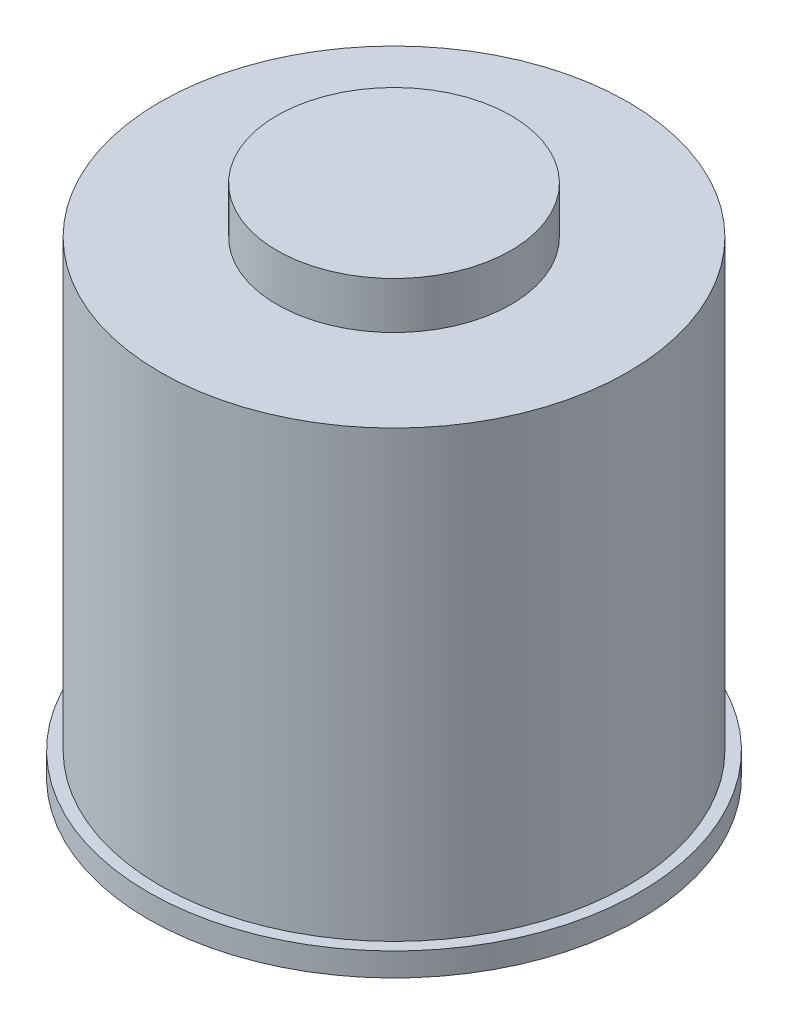
ISO-10303-21;
HEADER;
FILE_DESCRIPTION(('STEP AP214'),'2;1');
FILE_NAME('part.step','',(''),(''),'','','');
FILE_SCHEMA(('AUTOMOTIVE_DESIGN { 1 0 10303 214 1 1 1 1 }'));
ENDSEC;
DATA;
#1=APPLICATION_CONTEXT('core data for automotive mechanical design processes');
#2=APPLICATION_PROTOCOL_DEFINITION('international standard','automotive_design',2000,#1);
#3=PRODUCT_CONTEXT('',#1,'mechanical');
#4=PRODUCT('Part','Part','',(#3));
#5=PRODUCT_RELATED_PRODUCT_CATEGORY('part','',(#4));
#6=PRODUCT_DEFINITION_FORMATION('','',#4);
#7=PRODUCT_DEFINITION_CONTEXT('part definition',#1,'design');
#8=PRODUCT_DEFINITION('design','',#6,#7);
#9=PRODUCT_DEFINITION_SHAPE('','',#8);
#10=(LENGTH_UNIT() NAMED_UNIT(*) SI_UNIT(.MILLI.,.METRE.));
#11=(NAMED_UNIT(*) PLANE_ANGLE_UNIT() SI_UNIT($,.RADIAN.));
#12=(NAMED_UNIT(*) SI_UNIT($,.STERADIAN.) SOLID_ANGLE_UNIT());
#13=UNCERTAINTY_MEASURE_WITH_UNIT(LENGTH_MEASURE(1.E-05),#10,'distance_accuracy_value','');
#14=(GEOMETRIC_REPRESENTATION_CONTEXT(3) GLOBAL_UNCERTAINTY_ASSIGNED_CONTEXT((#13)) GLOBAL_UNIT_ASSIGNED_CONTEXT((#10,
#11,#12)) REPRESENTATION_CONTEXT('',''));
#15=CARTESIAN_POINT('',(0.,0.,0.));
#16=DIRECTION('',(0.,0.,1.));
#17=DIRECTION('',(1.,0.,0.));
#18=AXIS2_PLACEMENT_3D('',#15,#16,#17);
#19=CARTESIAN_POINT('',(0.,0.,0.));
#20=DIRECTION('',(0.,-1.,0.));
#21=DIRECTION('',(0.,0.,1.));
#22=AXIS2_PLACEMENT_3D('',#19,#20,#21);
#23=SPHERICAL_SURFACE('',#22,3.);
#24=CARTESIAN_POINT('',(0.,0.,0.));
#25=DIRECTION('',(0.,-1.,0.));
#26=DIRECTION('',(0.,0.,-1.));
#27=AXIS2_PLACEMENT_3D('',#24,#25,#26);
#28=CIRCLE('',#27,3.);
#29=CARTESIAN_POINT('',(0.,0.,-3.));
#30=VERTEX_POINT('',#29);
#31=EDGE_CURVE('E56',#30,#30,#28,.T.);
#32=ORIENTED_EDGE('',*,*,#31,.T.);
#33=EDGE_LOOP('',(#32));
#34=FACE_BOUND('',#33,.T.);
#35=ADVANCED_FACE('F31',(#34),#23,.T.);
#36=CARTESIAN_POINT('',(0.,22.,0.));
#37=DIRECTION('',(0.,1.,0.));
#38=DIRECTION('',(0.,0.,1.));
#39=AXIS2_PLACEMENT_3D('',#36,#37,#38);
#40=PLANE('',#39);
#41=CARTESIAN_POINT('',(0.,22.,0.));
#42=DIRECTION('',(0.,-1.,0.));
#43=DIRECTION('',(0.,0.,-1.));
#44=AXIS2_PLACEMENT_3D('',#41,#42,#43);
#45=CIRCLE('',#44,5.);
#46=CARTESIAN_POINT('',(0.,22.,-5.));
#47=VERTEX_POINT('',#46);
#48=EDGE_CURVE('E10',#47,#47,#45,.T.);
#49=ORIENTED_EDGE('',*,*,#48,.F.);
#50=EDGE_LOOP('',(#49));
#51=FACE_BOUND('',#50,.T.);
#52=ADVANCED_FACE('F73',(#51),#40,.T.);
#53=CARTESIAN_POINT('',(0.,0.,0.));
#54=DIRECTION('',(0.,-1.,0.));
#55=DIRECTION('',(0.,0.,-1.));
#56=AXIS2_PLACEMENT_3D('',#53,#54,#55);
#57=CYLINDRICAL_SURFACE('',#56,5.);
#58=ORIENTED_EDGE('',*,*,#48,.T.);
#59=EDGE_LOOP('',(#58));
#60=FACE_BOUND('',#59,.T.);
#61=CARTESIAN_POINT('',(0.,20.,0.));
#62=DIRECTION('',(0.,-1.,0.));
#63=DIRECTION('',(0.,0.,-1.));
#64=AXIS2_PLACEMENT_3D('',#61,#62,#63);
#65=CIRCLE('',#64,5.);
#66=CARTESIAN_POINT('',(0.,20.,-5.));
#67=VERTEX_POINT('',#66);
#68=EDGE_CURVE('E37',#67,#67,#65,.T.);
#69=ORIENTED_EDGE('',*,*,#68,.F.);
#70=EDGE_LOOP('',(#69));
#71=FACE_BOUND('',#70,.T.);
#72=ADVANCED_FACE('F77',(#60,#71),#57,.T.);
#73=CARTESIAN_POINT('',(0.,20.,-5.));
#74=DIRECTION('',(0.,1.,0.));
#75=DIRECTION('',(0.,0.,1.));
#76=AXIS2_PLACEMENT_3D('',#73,#74,#75);
#77=PLANE('',#76);
#78=ORIENTED_EDGE('',*,*,#68,.T.);
#79=EDGE_LOOP('',(#78));
#80=FACE_BOUND('',#79,.T.);
#81=CARTESIAN_POINT('',(0.,20.,0.));
#82=DIRECTION('',(0.,-1.,0.));
#83=DIRECTION('',(0.,0.,-1.));
#84=AXIS2_PLACEMENT_3D('',#81,#82,#83);
#85=CIRCLE('',#84,10.);
#86=CARTESIAN_POINT('',(0.,20.,-10.));
#87=VERTEX_POINT('',#86);
#88=EDGE_CURVE('E41',#87,#87,#85,.T.);
#89=ORIENTED_EDGE('',*,*,#88,.F.);
#90=EDGE_LOOP('',(#89));
#91=FACE_BOUND('',#90,.T.);
#92=ADVANCED_FACE('F82',(#80,#91),#77,.T.);
#93=CARTESIAN_POINT('',(0.,0.,0.));
#94=DIRECTION('',(0.,-1.,0.));
#95=DIRECTION('',(0.,0.,-1.));
#96=AXIS2_PLACEMENT_3D('',#93,#94,#95);
#97=CYLINDRICAL_SURFACE('',#96,10.);
#98=ORIENTED_EDGE('',*,*,#88,.T.);
#99=EDGE_LOOP('',(#98));
#100=FACE_BOUND('',#99,.T.);
#101=CARTESIAN_POINT('',(0.,0.999999999999998,0.));
#102=DIRECTION('',(0.,-1.,0.));
#103=DIRECTION('',(0.,0.,-1.));
#104=AXIS2_PLACEMENT_3D('',#101,#102,#103);
#105=CIRCLE('',#104,10.);
#106=CARTESIAN_POINT('',(0.,1.,-10.));
#107=VERTEX_POINT('',#106);
#108=EDGE_CURVE('E45',#107,#107,#105,.T.);
#109=ORIENTED_EDGE('',*,*,#108,.F.);
#110=EDGE_LOOP('',(#109));
#111=FACE_BOUND('',#110,.T.);
#112=ADVANCED_FACE('F87',(#100,#111),#97,.T.);
#113=CARTESIAN_POINT('',(0.,1.,-10.5));
#114=DIRECTION('',(0.,1.,0.));
#115=DIRECTION('',(0.,0.,1.));
#116=AXIS2_PLACEMENT_3D('',#113,#114,#115);
#117=PLANE('',#116);
#118=ORIENTED_EDGE('',*,*,#108,.T.);
#119=EDGE_LOOP('',(#118));
#120=FACE_BOUND('',#119,.T.);
#121=CARTESIAN_POINT('',(0.,0.999999999999998,0.));
#122=DIRECTION('',(0.,-1.,0.));
#123=DIRECTION('',(0.,0.,-1.));
#124=AXIS2_PLACEMENT_3D('',#121,#122,#123);
#125=CIRCLE('',#124,10.5);
#126=CARTESIAN_POINT('',(0.,1.,-10.5));
#127=VERTEX_POINT('',#126);
#128=EDGE_CURVE('E50',#127,#127,#125,.T.);
#129=ORIENTED_EDGE('',*,*,#128,.F.);
#130=EDGE_LOOP('',(#129));
#131=FACE_BOUND('',#130,.T.);
#132=ADVANCED_FACE('F69',(#120,#131),#117,.T.);
#133=CARTESIAN_POINT('',(0.,0.,0.));
#134=DIRECTION('',(0.,-1.,0.));
#135=DIRECTION('',(0.,0.,-1.));
#136=AXIS2_PLACEMENT_3D('',#133,#134,#135);
#137=CYLINDRICAL_SURFACE('',#136,10.5);
#138=ORIENTED_EDGE('',*,*,#128,.T.);
#139=EDGE_LOOP('',(#138));
#140=FACE_BOUND('',#139,.T.);
#141=CARTESIAN_POINT('',(0.,0.,0.));
#142=DIRECTION('',(0.,-1.,0.));
#143=DIRECTION('',(0.,0.,-1.));
#144=AXIS2_PLACEMENT_3D('',#141,#142,#143);
#145=CIRCLE('',#144,10.5);
#146=CARTESIAN_POINT('',(0.,0.,-10.5));
#147=VERTEX_POINT('',#146);
#148=EDGE_CURVE('E53',#147,#147,#145,.T.);
#149=ORIENTED_EDGE('',*,*,#148,.F.);
#150=EDGE_LOOP('',(#149));
#151=FACE_BOUND('',#150,.T.);
#152=ADVANCED_FACE('F63',(#140,#151),#137,.T.);
#153=CARTESIAN_POINT('',(0.,0.,-10.5));
#154=DIRECTION('',(0.,-1.,0.));
#155=DIRECTION('',(0.,0.,-1.));
#156=AXIS2_PLACEMENT_3D('',#153,#154,#155);
#157=PLANE('',#156);
#158=ORIENTED_EDGE('',*,*,#148,.T.);
#159=EDGE_LOOP('',(#158));
#160=FACE_BOUND('',#159,.T.);
#161=ORIENTED_EDGE('',*,*,#31,.F.);
#162=EDGE_LOOP('',(#161));
#163=FACE_BOUND('',#162,.T.);
#164=ADVANCED_FACE('F61',(#160,#163),#157,.T.);
#165=CLOSED_SHELL('',(#35,#52,#72,#92,#112,#132,#152,#164));
#166=MANIFOLD_SOLID_BREP('B2',#165);
#167=ADVANCED_BREP_SHAPE_REPRESENTATION('',(#18,#166),#14);
#168=SHAPE_DEFINITION_REPRESENTATION(#9,#167);
ENDSEC;
END-ISO-10303-21;
